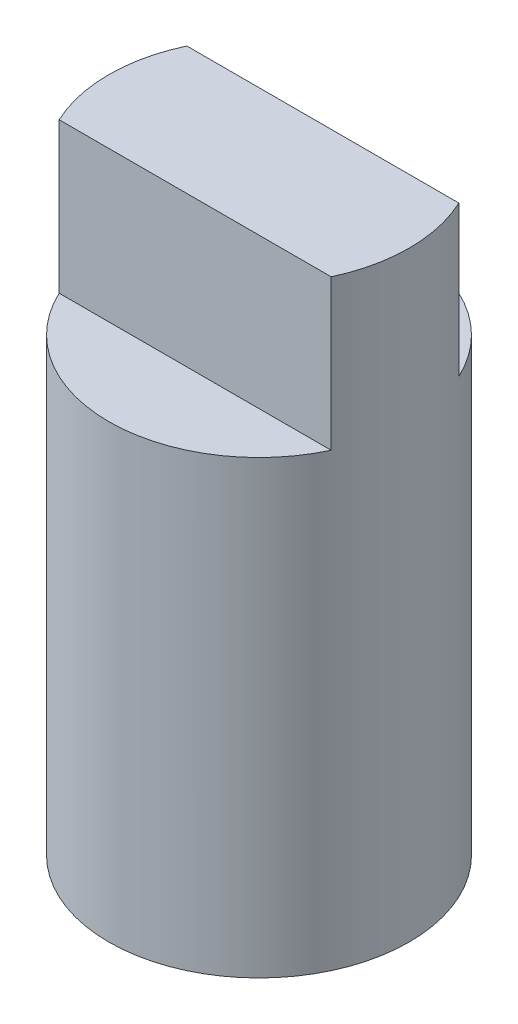
ISO-10303-21;
HEADER;
FILE_DESCRIPTION(('STEP AP214'),'2;1');
FILE_NAME('part.step','',(''),(''),'','','');
FILE_SCHEMA(('AUTOMOTIVE_DESIGN { 1 0 10303 214 1 1 1 1 }'));
ENDSEC;
DATA;
#1=APPLICATION_CONTEXT('core data for automotive mechanical design processes');
#2=APPLICATION_PROTOCOL_DEFINITION('international standard','automotive_design',2000,#1);
#3=PRODUCT_CONTEXT('',#1,'mechanical');
#4=PRODUCT('Part','Part','',(#3));
#5=PRODUCT_RELATED_PRODUCT_CATEGORY('part','',(#4));
#6=PRODUCT_DEFINITION_FORMATION('','',#4);
#7=PRODUCT_DEFINITION_CONTEXT('part definition',#1,'design');
#8=PRODUCT_DEFINITION('design','',#6,#7);
#9=PRODUCT_DEFINITION_SHAPE('','',#8);
#10=(LENGTH_UNIT() NAMED_UNIT(*) SI_UNIT(.MILLI.,.METRE.));
#11=(NAMED_UNIT(*) PLANE_ANGLE_UNIT() SI_UNIT($,.RADIAN.));
#12=(NAMED_UNIT(*) SI_UNIT($,.STERADIAN.) SOLID_ANGLE_UNIT());
#13=UNCERTAINTY_MEASURE_WITH_UNIT(LENGTH_MEASURE(1.E-05),#10,'distance_accuracy_value','');
#14=(GEOMETRIC_REPRESENTATION_CONTEXT(3) GLOBAL_UNCERTAINTY_ASSIGNED_CONTEXT((#13)) GLOBAL_UNIT_ASSIGNED_CONTEXT((#10,
#11,#12)) REPRESENTATION_CONTEXT('',''));
#15=CARTESIAN_POINT('',(0.,0.,0.));
#16=DIRECTION('',(0.,0.,1.));
#17=DIRECTION('',(1.,0.,0.));
#18=AXIS2_PLACEMENT_3D('',#15,#16,#17);
#19=CARTESIAN_POINT('',(0.,101.6,0.));
#20=DIRECTION('',(0.,-1.,0.));
#21=DIRECTION('',(0.,0.,-1.));
#22=AXIS2_PLACEMENT_3D('',#19,#20,#21);
#23=CYLINDRICAL_SURFACE('',#22,25.4);
#24=CARTESIAN_POINT('',(0.,101.6,0.));
#25=DIRECTION('',(0.,1.,0.));
#26=DIRECTION('',(0.,0.,1.));
#27=AXIS2_PLACEMENT_3D('',#24,#25,#26);
#28=CIRCLE('',#27,25.4);
#29=CARTESIAN_POINT('',(22.9919110775942,101.6,10.795));
#30=VERTEX_POINT('',#29);
#31=CARTESIAN_POINT('',(22.9919110775942,101.6,-10.795));
#32=VERTEX_POINT('',#31);
#33=EDGE_CURVE('E11',#30,#32,#28,.T.);
#34=ORIENTED_EDGE('',*,*,#33,.F.);
#35=DIRECTION('',(0.,-1.,0.));
#36=VECTOR('',#35,1.);
#37=CARTESIAN_POINT('',(22.9919110775942,101.6,10.795));
#38=LINE('',#37,#36);
#39=CARTESIAN_POINT('',(22.9919110775942,76.2,10.795));
#40=VERTEX_POINT('',#39);
#41=EDGE_CURVE('E62',#40,#30,#38,.F.);
#42=ORIENTED_EDGE('',*,*,#41,.F.);
#43=CARTESIAN_POINT('',(0.,76.2,0.));
#44=DIRECTION('',(0.,-1.,0.));
#45=DIRECTION('',(0.,0.,-1.));
#46=AXIS2_PLACEMENT_3D('',#43,#44,#45);
#47=CIRCLE('',#46,25.4);
#48=CARTESIAN_POINT('',(-22.9919110775942,76.2,10.795));
#49=VERTEX_POINT('',#48);
#50=EDGE_CURVE('E93',#49,#40,#47,.F.);
#51=ORIENTED_EDGE('',*,*,#50,.F.);
#52=DIRECTION('',(0.,-1.,0.));
#53=VECTOR('',#52,1.);
#54=CARTESIAN_POINT('',(-22.9919110775942,101.6,10.795));
#55=LINE('',#54,#53);
#56=CARTESIAN_POINT('',(-22.9919110775942,101.6,10.795));
#57=VERTEX_POINT('',#56);
#58=EDGE_CURVE('E83',#57,#49,#55,.T.);
#59=ORIENTED_EDGE('',*,*,#58,.F.);
#60=CARTESIAN_POINT('',(-22.9919110775942,101.6,-10.795));
#61=VERTEX_POINT('',#60);
#62=EDGE_CURVE('E47',#61,#57,#28,.T.);
#63=ORIENTED_EDGE('',*,*,#62,.F.);
#64=DIRECTION('',(0.,-1.,0.));
#65=VECTOR('',#64,1.);
#66=CARTESIAN_POINT('',(-22.9919110775942,101.6,-10.795));
#67=LINE('',#66,#65);
#68=CARTESIAN_POINT('',(-22.9919110775942,76.2,-10.795));
#69=VERTEX_POINT('',#68);
#70=EDGE_CURVE('E54',#69,#61,#67,.F.);
#71=ORIENTED_EDGE('',*,*,#70,.F.);
#72=CARTESIAN_POINT('',(0.,76.2,0.));
#73=DIRECTION('',(0.,-1.,0.));
#74=DIRECTION('',(0.,0.,-1.));
#75=AXIS2_PLACEMENT_3D('',#72,#73,#74);
#76=CIRCLE('',#75,25.4);
#77=CARTESIAN_POINT('',(22.9919110775942,76.2,-10.795));
#78=VERTEX_POINT('',#77);
#79=EDGE_CURVE('E105',#78,#69,#76,.F.);
#80=ORIENTED_EDGE('',*,*,#79,.F.);
#81=DIRECTION('',(0.,-1.,0.));
#82=VECTOR('',#81,1.);
#83=CARTESIAN_POINT('',(22.9919110775942,101.6,-10.795));
#84=LINE('',#83,#82);
#85=EDGE_CURVE('E99',#32,#78,#84,.T.);
#86=ORIENTED_EDGE('',*,*,#85,.F.);
#87=EDGE_LOOP('',(#34,#42,#51,#59,#63,#71,#80,#86));
#88=FACE_BOUND('',#87,.T.);
#89=CARTESIAN_POINT('',(0.,0.,0.));
#90=DIRECTION('',(0.,1.,0.));
#91=DIRECTION('',(0.,0.,1.));
#92=AXIS2_PLACEMENT_3D('',#89,#90,#91);
#93=CIRCLE('',#92,25.4);
#94=CARTESIAN_POINT('',(0.,0.,25.4));
#95=VERTEX_POINT('',#94);
#96=EDGE_CURVE('E42',#95,#95,#93,.T.);
#97=ORIENTED_EDGE('',*,*,#96,.T.);
#98=EDGE_LOOP('',(#97));
#99=FACE_BOUND('',#98,.T.);
#100=ADVANCED_FACE('F39',(#88,#99),#23,.T.);
#101=CARTESIAN_POINT('',(0.,101.6,0.));
#102=DIRECTION('',(0.,1.,0.));
#103=DIRECTION('',(0.,0.,1.));
#104=AXIS2_PLACEMENT_3D('',#101,#102,#103);
#105=PLANE('',#104);
#106=DIRECTION('',(1.,0.,0.));
#107=VECTOR('',#106,1.);
#108=CARTESIAN_POINT('',(-25.401,101.6,10.795));
#109=LINE('',#108,#107);
#110=EDGE_CURVE('E80',#57,#30,#109,.T.);
#111=ORIENTED_EDGE('',*,*,#110,.T.);
#112=ORIENTED_EDGE('',*,*,#33,.T.);
#113=DIRECTION('',(1.,0.,0.));
#114=VECTOR('',#113,1.);
#115=CARTESIAN_POINT('',(-25.401,101.6,-10.795));
#116=LINE('',#115,#114);
#117=EDGE_CURVE('E96',#61,#32,#116,.T.);
#118=ORIENTED_EDGE('',*,*,#117,.F.);
#119=ORIENTED_EDGE('',*,*,#62,.T.);
#120=EDGE_LOOP('',(#111,#112,#118,#119));
#121=FACE_BOUND('',#120,.T.);
#122=ADVANCED_FACE('F95',(#121),#105,.T.);
#123=CARTESIAN_POINT('',(0.,0.,0.));
#124=DIRECTION('',(0.,1.,0.));
#125=DIRECTION('',(0.,0.,1.));
#126=AXIS2_PLACEMENT_3D('',#123,#124,#125);
#127=PLANE('',#126);
#128=ORIENTED_EDGE('',*,*,#96,.F.);
#129=EDGE_LOOP('',(#128));
#130=FACE_BOUND('',#129,.T.);
#131=ADVANCED_FACE('F124',(#130),#127,.F.);
#132=CARTESIAN_POINT('',(-25.401,101.6,-10.795));
#133=DIRECTION('',(0.,0.,1.));
#134=DIRECTION('',(1.,0.,0.));
#135=AXIS2_PLACEMENT_3D('',#132,#133,#134);
#136=PLANE('',#135);
#137=ORIENTED_EDGE('',*,*,#70,.T.);
#138=ORIENTED_EDGE('',*,*,#117,.T.);
#139=ORIENTED_EDGE('',*,*,#85,.T.);
#140=DIRECTION('',(1.,0.,0.));
#141=VECTOR('',#140,1.);
#142=CARTESIAN_POINT('',(-25.401,76.2,-10.795));
#143=LINE('',#142,#141);
#144=EDGE_CURVE('E103',#69,#78,#143,.T.);
#145=ORIENTED_EDGE('',*,*,#144,.F.);
#146=EDGE_LOOP('',(#137,#138,#139,#145));
#147=FACE_BOUND('',#146,.T.);
#148=ADVANCED_FACE('F114',(#147),#136,.F.);
#149=CARTESIAN_POINT('',(-25.401,76.2,-10.795));
#150=DIRECTION('',(0.,-1.,0.));
#151=DIRECTION('',(0.,0.,-1.));
#152=AXIS2_PLACEMENT_3D('',#149,#150,#151);
#153=PLANE('',#152);
#154=ORIENTED_EDGE('',*,*,#144,.T.);
#155=ORIENTED_EDGE('',*,*,#79,.T.);
#156=EDGE_LOOP('',(#154,#155));
#157=FACE_BOUND('',#156,.T.);
#158=ADVANCED_FACE('F116',(#157),#153,.F.);
#159=CARTESIAN_POINT('',(-25.401,101.6,10.795));
#160=DIRECTION('',(0.,0.,-1.));
#161=DIRECTION('',(-1.,0.,0.));
#162=AXIS2_PLACEMENT_3D('',#159,#160,#161);
#163=PLANE('',#162);
#164=ORIENTED_EDGE('',*,*,#41,.T.);
#165=ORIENTED_EDGE('',*,*,#110,.F.);
#166=ORIENTED_EDGE('',*,*,#58,.T.);
#167=DIRECTION('',(1.,0.,0.));
#168=VECTOR('',#167,1.);
#169=CARTESIAN_POINT('',(-25.401,76.2,10.795));
#170=LINE('',#169,#168);
#171=EDGE_CURVE('E88',#49,#40,#170,.T.);
#172=ORIENTED_EDGE('',*,*,#171,.T.);
#173=EDGE_LOOP('',(#164,#165,#166,#172));
#174=FACE_BOUND('',#173,.T.);
#175=ADVANCED_FACE('F82',(#174),#163,.F.);
#176=CARTESIAN_POINT('',(-25.401,76.2,10.795));
#177=DIRECTION('',(0.,-1.,0.));
#178=DIRECTION('',(0.,0.,-1.));
#179=AXIS2_PLACEMENT_3D('',#176,#177,#178);
#180=PLANE('',#179);
#181=ORIENTED_EDGE('',*,*,#50,.T.);
#182=ORIENTED_EDGE('',*,*,#171,.F.);
#183=EDGE_LOOP('',(#181,#182));
#184=FACE_BOUND('',#183,.T.);
#185=ADVANCED_FACE('F111',(#184),#180,.F.);
#186=CLOSED_SHELL('',(#100,#122,#131,#148,#158,#175,#185));
#187=MANIFOLD_SOLID_BREP('B2',#186);
#188=ADVANCED_BREP_SHAPE_REPRESENTATION('',(#18,#187),#14);
#189=SHAPE_DEFINITION_REPRESENTATION(#9,#188);
ENDSEC;
END-ISO-10303-21;
